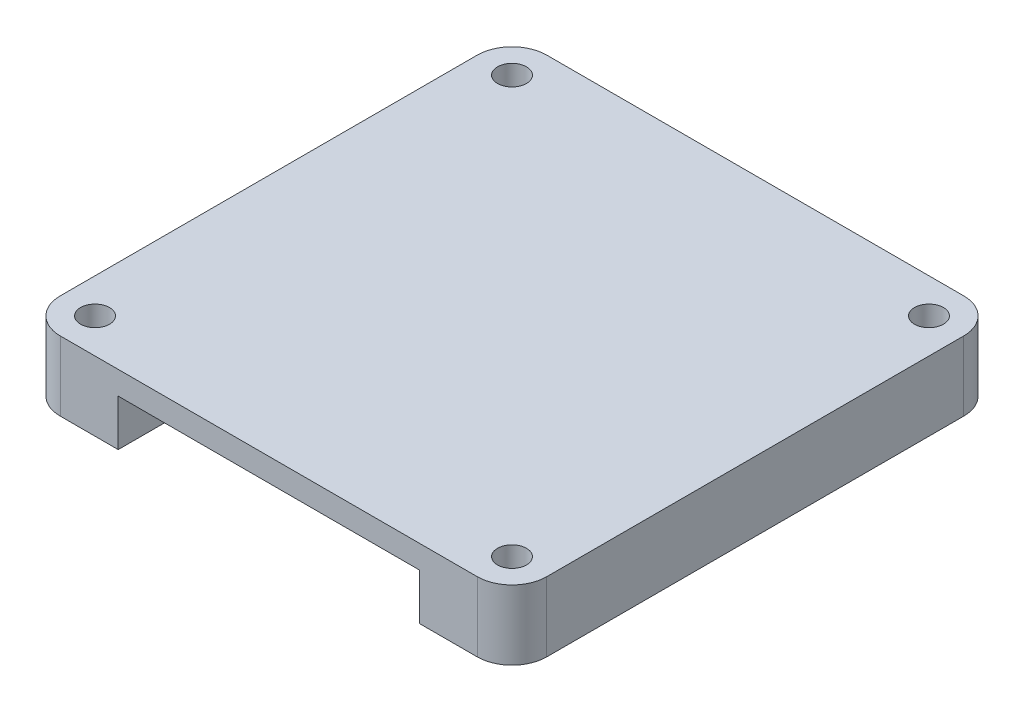
ISO-10303-21;
HEADER;
FILE_DESCRIPTION(('STEP AP214'),'2;1');
FILE_NAME('part.step','',(''),(''),'','','');
FILE_SCHEMA(('AUTOMOTIVE_DESIGN { 1 0 10303 214 1 1 1 1 }'));
ENDSEC;
DATA;
#1=APPLICATION_CONTEXT('core data for automotive mechanical design processes');
#2=APPLICATION_PROTOCOL_DEFINITION('international standard','automotive_design',2000,#1);
#3=PRODUCT_CONTEXT('',#1,'mechanical');
#4=PRODUCT('Part','Part','',(#3));
#5=PRODUCT_RELATED_PRODUCT_CATEGORY('part','',(#4));
#6=PRODUCT_DEFINITION_FORMATION('','',#4);
#7=PRODUCT_DEFINITION_CONTEXT('part definition',#1,'design');
#8=PRODUCT_DEFINITION('design','',#6,#7);
#9=PRODUCT_DEFINITION_SHAPE('','',#8);
#10=(LENGTH_UNIT() NAMED_UNIT(*) SI_UNIT(.MILLI.,.METRE.));
#11=(NAMED_UNIT(*) PLANE_ANGLE_UNIT() SI_UNIT($,.RADIAN.));
#12=(NAMED_UNIT(*) SI_UNIT($,.STERADIAN.) SOLID_ANGLE_UNIT());
#13=UNCERTAINTY_MEASURE_WITH_UNIT(LENGTH_MEASURE(1.E-05),#10,'distance_accuracy_value','');
#14=(GEOMETRIC_REPRESENTATION_CONTEXT(3) GLOBAL_UNCERTAINTY_ASSIGNED_CONTEXT((#13)) GLOBAL_UNIT_ASSIGNED_CONTEXT((#10,
#11,#12)) REPRESENTATION_CONTEXT('',''));
#15=CARTESIAN_POINT('',(0.,0.,0.));
#16=DIRECTION('',(0.,0.,1.));
#17=DIRECTION('',(1.,0.,0.));
#18=AXIS2_PLACEMENT_3D('',#15,#16,#17);
#19=CARTESIAN_POINT('',(36.,0.,0.));
#20=DIRECTION('',(0.,1.,0.));
#21=DIRECTION('',(0.,0.,1.));
#22=AXIS2_PLACEMENT_3D('',#19,#20,#21);
#23=PLANE('',#22);
#24=DIRECTION('',(0.,0.,1.));
#25=VECTOR('',#24,1.);
#26=CARTESIAN_POINT('',(5.,0.,-39.));
#27=LINE('',#26,#25);
#28=CARTESIAN_POINT('',(5.,0.,-39.));
#29=VERTEX_POINT('',#28);
#30=CARTESIAN_POINT('',(5.,0.,3.));
#31=VERTEX_POINT('',#30);
#32=EDGE_CURVE('E153',#29,#31,#27,.T.);
#33=ORIENTED_EDGE('',*,*,#32,.F.);
#34=DIRECTION('',(-1.,0.,0.));
#35=VECTOR('',#34,1.);
#36=CARTESIAN_POINT('',(0.,0.,-39.));
#37=LINE('',#36,#35);
#38=CARTESIAN_POINT('',(31.,0.,-39.));
#39=VERTEX_POINT('',#38);
#40=EDGE_CURVE('E212',#39,#29,#37,.T.);
#41=ORIENTED_EDGE('',*,*,#40,.F.);
#42=DIRECTION('',(0.,0.,-1.));
#43=VECTOR('',#42,1.);
#44=CARTESIAN_POINT('',(31.,0.,3.));
#45=LINE('',#44,#43);
#46=CARTESIAN_POINT('',(31.,0.,3.));
#47=VERTEX_POINT('',#46);
#48=EDGE_CURVE('E175',#47,#39,#45,.T.);
#49=ORIENTED_EDGE('',*,*,#48,.F.);
#50=DIRECTION('',(1.,0.,0.));
#51=VECTOR('',#50,1.);
#52=CARTESIAN_POINT('',(0.,0.,3.));
#53=LINE('',#52,#51);
#54=EDGE_CURVE('E56',#31,#47,#53,.T.);
#55=ORIENTED_EDGE('',*,*,#54,.F.);
#56=EDGE_LOOP('',(#33,#41,#49,#55));
#57=FACE_BOUND('',#56,.T.);
#58=ADVANCED_FACE('F36',(#57),#23,.F.);
#59=CARTESIAN_POINT('',(36.,2.,0.));
#60=DIRECTION('',(0.,1.,0.));
#61=DIRECTION('',(0.,0.,1.));
#62=AXIS2_PLACEMENT_3D('',#59,#60,#61);
#63=PLANE('',#62);
#64=CARTESIAN_POINT('',(0.,2.,0.));
#65=DIRECTION('',(0.,1.,0.));
#66=DIRECTION('',(0.,0.,1.));
#67=AXIS2_PLACEMENT_3D('',#64,#65,#66);
#68=CIRCLE('',#67,1.25);
#69=CARTESIAN_POINT('',(0.,2.,1.25));
#70=VERTEX_POINT('',#69);
#71=EDGE_CURVE('E203',#70,#70,#68,.T.);
#72=ORIENTED_EDGE('',*,*,#71,.F.);
#73=EDGE_LOOP('',(#72));
#74=FACE_BOUND('',#73,.T.);
#75=CARTESIAN_POINT('',(0.,2.,-36.));
#76=DIRECTION('',(0.,1.,0.));
#77=DIRECTION('',(0.,0.,1.));
#78=AXIS2_PLACEMENT_3D('',#75,#76,#77);
#79=CIRCLE('',#78,1.25);
#80=CARTESIAN_POINT('',(0.,2.,-34.75));
#81=VERTEX_POINT('',#80);
#82=EDGE_CURVE('E209',#81,#81,#79,.T.);
#83=ORIENTED_EDGE('',*,*,#82,.F.);
#84=EDGE_LOOP('',(#83));
#85=FACE_BOUND('',#84,.T.);
#86=CARTESIAN_POINT('',(36.,2.,0.));
#87=DIRECTION('',(0.,1.,0.));
#88=DIRECTION('',(0.,0.,1.));
#89=AXIS2_PLACEMENT_3D('',#86,#87,#88);
#90=CIRCLE('',#89,3.);
#91=CARTESIAN_POINT('',(36.,2.,3.));
#92=VERTEX_POINT('',#91);
#93=CARTESIAN_POINT('',(39.,2.,0.));
#94=VERTEX_POINT('',#93);
#95=EDGE_CURVE('E213',#92,#94,#90,.T.);
#96=ORIENTED_EDGE('',*,*,#95,.T.);
#97=DIRECTION('',(0.,0.,-1.));
#98=VECTOR('',#97,1.);
#99=CARTESIAN_POINT('',(39.,2.,0.));
#100=LINE('',#99,#98);
#101=CARTESIAN_POINT('',(39.,2.,-36.));
#102=VERTEX_POINT('',#101);
#103=EDGE_CURVE('E216',#94,#102,#100,.T.);
#104=ORIENTED_EDGE('',*,*,#103,.T.);
#105=CARTESIAN_POINT('',(36.,2.,-36.));
#106=DIRECTION('',(0.,1.,0.));
#107=DIRECTION('',(0.,0.,-1.));
#108=AXIS2_PLACEMENT_3D('',#105,#106,#107);
#109=CIRCLE('',#108,3.);
#110=CARTESIAN_POINT('',(36.,2.,-39.));
#111=VERTEX_POINT('',#110);
#112=EDGE_CURVE('E218',#102,#111,#109,.T.);
#113=ORIENTED_EDGE('',*,*,#112,.T.);
#114=DIRECTION('',(-1.,0.,0.));
#115=VECTOR('',#114,1.);
#116=CARTESIAN_POINT('',(0.,2.,-39.));
#117=LINE('',#116,#115);
#118=CARTESIAN_POINT('',(0.,2.,-39.));
#119=VERTEX_POINT('',#118);
#120=EDGE_CURVE('E220',#111,#119,#117,.T.);
#121=ORIENTED_EDGE('',*,*,#120,.T.);
#122=CARTESIAN_POINT('',(0.,2.,-36.));
#123=DIRECTION('',(0.,1.,0.));
#124=DIRECTION('',(0.,0.,-1.));
#125=AXIS2_PLACEMENT_3D('',#122,#123,#124);
#126=CIRCLE('',#125,3.);
#127=CARTESIAN_POINT('',(-3.,2.,-36.));
#128=VERTEX_POINT('',#127);
#129=EDGE_CURVE('E132',#119,#128,#126,.T.);
#130=ORIENTED_EDGE('',*,*,#129,.T.);
#131=DIRECTION('',(0.,0.,1.));
#132=VECTOR('',#131,1.);
#133=CARTESIAN_POINT('',(-3.,2.,0.));
#134=LINE('',#133,#132);
#135=CARTESIAN_POINT('',(-3.,2.,0.));
#136=VERTEX_POINT('',#135);
#137=EDGE_CURVE('E223',#128,#136,#134,.T.);
#138=ORIENTED_EDGE('',*,*,#137,.T.);
#139=CARTESIAN_POINT('',(0.,2.,0.));
#140=DIRECTION('',(0.,1.,0.));
#141=DIRECTION('',(0.,0.,-1.));
#142=AXIS2_PLACEMENT_3D('',#139,#140,#141);
#143=CIRCLE('',#142,3.);
#144=CARTESIAN_POINT('',(0.,2.,3.));
#145=VERTEX_POINT('',#144);
#146=EDGE_CURVE('E225',#136,#145,#143,.T.);
#147=ORIENTED_EDGE('',*,*,#146,.T.);
#148=DIRECTION('',(1.,0.,0.));
#149=VECTOR('',#148,1.);
#150=CARTESIAN_POINT('',(0.,2.,3.));
#151=LINE('',#150,#149);
#152=EDGE_CURVE('E227',#145,#92,#151,.T.);
#153=ORIENTED_EDGE('',*,*,#152,.T.);
#154=EDGE_LOOP('',(#96,#104,#113,#121,#130,#138,#147,#153));
#155=FACE_BOUND('',#154,.T.);
#156=CARTESIAN_POINT('',(36.,2.,-36.));
#157=DIRECTION('',(0.,1.,0.));
#158=DIRECTION('',(0.,0.,1.));
#159=AXIS2_PLACEMENT_3D('',#156,#157,#158);
#160=CIRCLE('',#159,1.25);
#161=CARTESIAN_POINT('',(36.,2.,-34.75));
#162=VERTEX_POINT('',#161);
#163=EDGE_CURVE('E206',#162,#162,#160,.T.);
#164=ORIENTED_EDGE('',*,*,#163,.F.);
#165=EDGE_LOOP('',(#164));
#166=FACE_BOUND('',#165,.T.);
#167=CARTESIAN_POINT('',(36.,2.,0.));
#168=DIRECTION('',(0.,1.,0.));
#169=DIRECTION('',(0.,0.,1.));
#170=AXIS2_PLACEMENT_3D('',#167,#168,#169);
#171=CIRCLE('',#170,1.25);
#172=CARTESIAN_POINT('',(36.,2.,1.25));
#173=VERTEX_POINT('',#172);
#174=EDGE_CURVE('E200',#173,#173,#171,.T.);
#175=ORIENTED_EDGE('',*,*,#174,.F.);
#176=EDGE_LOOP('',(#175));
#177=FACE_BOUND('',#176,.T.);
#178=ADVANCED_FACE('F263',(#74,#85,#155,#166,#177),#63,.T.);
#179=CARTESIAN_POINT('',(36.,2.,0.));
#180=DIRECTION('',(0.,-1.,0.));
#181=DIRECTION('',(0.,0.,-1.));
#182=AXIS2_PLACEMENT_3D('',#179,#180,#181);
#183=CYLINDRICAL_SURFACE('',#182,3.);
#184=DIRECTION('',(0.,-1.,0.));
#185=VECTOR('',#184,1.);
#186=CARTESIAN_POINT('',(36.,2.,3.));
#187=LINE('',#186,#185);
#188=CARTESIAN_POINT('',(36.,-4.,3.));
#189=VERTEX_POINT('',#188);
#190=EDGE_CURVE('E229',#92,#189,#187,.T.);
#191=ORIENTED_EDGE('',*,*,#190,.T.);
#192=CARTESIAN_POINT('',(36.,-4.,0.));
#193=DIRECTION('',(0.,-1.,0.));
#194=DIRECTION('',(0.,0.,-1.));
#195=AXIS2_PLACEMENT_3D('',#192,#193,#194);
#196=CIRCLE('',#195,3.);
#197=CARTESIAN_POINT('',(39.,-4.,0.));
#198=VERTEX_POINT('',#197);
#199=EDGE_CURVE('E176',#198,#189,#196,.T.);
#200=ORIENTED_EDGE('',*,*,#199,.F.);
#201=DIRECTION('',(0.,-1.,0.));
#202=VECTOR('',#201,1.);
#203=CARTESIAN_POINT('',(39.,2.,0.));
#204=LINE('',#203,#202);
#205=EDGE_CURVE('E11',#94,#198,#204,.T.);
#206=ORIENTED_EDGE('',*,*,#205,.F.);
#207=ORIENTED_EDGE('',*,*,#95,.F.);
#208=EDGE_LOOP('',(#191,#200,#206,#207));
#209=FACE_BOUND('',#208,.T.);
#210=ADVANCED_FACE('F38',(#209),#183,.T.);
#211=CARTESIAN_POINT('',(39.,2.,0.));
#212=DIRECTION('',(-1.,0.,0.));
#213=DIRECTION('',(0.,0.,1.));
#214=AXIS2_PLACEMENT_3D('',#211,#212,#213);
#215=PLANE('',#214);
#216=ORIENTED_EDGE('',*,*,#205,.T.);
#217=DIRECTION('',(0.,0.,1.));
#218=VECTOR('',#217,1.);
#219=CARTESIAN_POINT('',(39.,-4.,0.));
#220=LINE('',#219,#218);
#221=CARTESIAN_POINT('',(39.,-4.,-36.));
#222=VERTEX_POINT('',#221);
#223=EDGE_CURVE('E189',#222,#198,#220,.T.);
#224=ORIENTED_EDGE('',*,*,#223,.F.);
#225=DIRECTION('',(0.,-1.,0.));
#226=VECTOR('',#225,1.);
#227=CARTESIAN_POINT('',(39.,2.,-36.));
#228=LINE('',#227,#226);
#229=EDGE_CURVE('E44',#102,#222,#228,.T.);
#230=ORIENTED_EDGE('',*,*,#229,.F.);
#231=ORIENTED_EDGE('',*,*,#103,.F.);
#232=EDGE_LOOP('',(#216,#224,#230,#231));
#233=FACE_BOUND('',#232,.T.);
#234=ADVANCED_FACE('F251',(#233),#215,.F.);
#235=CARTESIAN_POINT('',(36.,2.,-36.));
#236=DIRECTION('',(0.,-1.,0.));
#237=DIRECTION('',(0.,0.,-1.));
#238=AXIS2_PLACEMENT_3D('',#235,#236,#237);
#239=CYLINDRICAL_SURFACE('',#238,3.);
#240=ORIENTED_EDGE('',*,*,#229,.T.);
#241=CARTESIAN_POINT('',(36.,-4.,-36.));
#242=DIRECTION('',(0.,-1.,0.));
#243=DIRECTION('',(0.,0.,-1.));
#244=AXIS2_PLACEMENT_3D('',#241,#242,#243);
#245=CIRCLE('',#244,3.);
#246=CARTESIAN_POINT('',(36.,-4.,-39.));
#247=VERTEX_POINT('',#246);
#248=EDGE_CURVE('E186',#247,#222,#245,.T.);
#249=ORIENTED_EDGE('',*,*,#248,.F.);
#250=DIRECTION('',(0.,-1.,0.));
#251=VECTOR('',#250,1.);
#252=CARTESIAN_POINT('',(36.,2.,-39.));
#253=LINE('',#252,#251);
#254=EDGE_CURVE('E135',#111,#247,#253,.T.);
#255=ORIENTED_EDGE('',*,*,#254,.F.);
#256=ORIENTED_EDGE('',*,*,#112,.F.);
#257=EDGE_LOOP('',(#240,#249,#255,#256));
#258=FACE_BOUND('',#257,.T.);
#259=ADVANCED_FACE('F242',(#258),#239,.T.);
#260=CARTESIAN_POINT('',(0.,2.,-39.));
#261=DIRECTION('',(0.,0.,1.));
#262=DIRECTION('',(1.,0.,0.));
#263=AXIS2_PLACEMENT_3D('',#260,#261,#262);
#264=PLANE('',#263);
#265=ORIENTED_EDGE('',*,*,#254,.T.);
#266=DIRECTION('',(1.,0.,0.));
#267=VECTOR('',#266,1.);
#268=CARTESIAN_POINT('',(31.,-4.,-39.));
#269=LINE('',#268,#267);
#270=CARTESIAN_POINT('',(31.,-4.,-39.));
#271=VERTEX_POINT('',#270);
#272=EDGE_CURVE('E183',#271,#247,#269,.T.);
#273=ORIENTED_EDGE('',*,*,#272,.F.);
#274=DIRECTION('',(0.,1.,0.));
#275=VECTOR('',#274,1.);
#276=CARTESIAN_POINT('',(31.,-4.,-39.));
#277=LINE('',#276,#275);
#278=EDGE_CURVE('E192',#271,#39,#277,.T.);
#279=ORIENTED_EDGE('',*,*,#278,.T.);
#280=ORIENTED_EDGE('',*,*,#40,.T.);
#281=DIRECTION('',(0.,1.,0.));
#282=VECTOR('',#281,1.);
#283=CARTESIAN_POINT('',(5.,-4.,-39.));
#284=LINE('',#283,#282);
#285=CARTESIAN_POINT('',(5.,-4.,-39.));
#286=VERTEX_POINT('',#285);
#287=EDGE_CURVE('E142',#286,#29,#284,.T.);
#288=ORIENTED_EDGE('',*,*,#287,.F.);
#289=DIRECTION('',(1.,0.,0.));
#290=VECTOR('',#289,1.);
#291=CARTESIAN_POINT('',(5.,-4.,-39.));
#292=LINE('',#291,#290);
#293=CARTESIAN_POINT('',(0.,-4.,-39.));
#294=VERTEX_POINT('',#293);
#295=EDGE_CURVE('E139',#294,#286,#292,.T.);
#296=ORIENTED_EDGE('',*,*,#295,.F.);
#297=DIRECTION('',(0.,-1.,0.));
#298=VECTOR('',#297,1.);
#299=CARTESIAN_POINT('',(0.,2.,-39.));
#300=LINE('',#299,#298);
#301=EDGE_CURVE('E126',#119,#294,#300,.T.);
#302=ORIENTED_EDGE('',*,*,#301,.F.);
#303=ORIENTED_EDGE('',*,*,#120,.F.);
#304=EDGE_LOOP('',(#265,#273,#279,#280,#288,#296,#302,#303));
#305=FACE_BOUND('',#304,.T.);
#306=ADVANCED_FACE('F140',(#305),#264,.F.);
#307=CARTESIAN_POINT('',(0.,2.,-36.));
#308=DIRECTION('',(0.,-1.,0.));
#309=DIRECTION('',(0.,0.,-1.));
#310=AXIS2_PLACEMENT_3D('',#307,#308,#309);
#311=CYLINDRICAL_SURFACE('',#310,3.);
#312=ORIENTED_EDGE('',*,*,#301,.T.);
#313=CARTESIAN_POINT('',(0.,-4.,-36.));
#314=DIRECTION('',(0.,-1.,0.));
#315=DIRECTION('',(0.,0.,-1.));
#316=AXIS2_PLACEMENT_3D('',#313,#314,#315);
#317=CIRCLE('',#316,3.);
#318=CARTESIAN_POINT('',(-3.,-4.,-36.));
#319=VERTEX_POINT('',#318);
#320=EDGE_CURVE('E131',#319,#294,#317,.T.);
#321=ORIENTED_EDGE('',*,*,#320,.F.);
#322=DIRECTION('',(0.,-1.,0.));
#323=VECTOR('',#322,1.);
#324=CARTESIAN_POINT('',(-3.,2.,-36.));
#325=LINE('',#324,#323);
#326=EDGE_CURVE('E136',#128,#319,#325,.T.);
#327=ORIENTED_EDGE('',*,*,#326,.F.);
#328=ORIENTED_EDGE('',*,*,#129,.F.);
#329=EDGE_LOOP('',(#312,#321,#327,#328));
#330=FACE_BOUND('',#329,.T.);
#331=ADVANCED_FACE('F128',(#330),#311,.T.);
#332=CARTESIAN_POINT('',(-3.,2.,0.));
#333=DIRECTION('',(1.,0.,0.));
#334=DIRECTION('',(0.,0.,-1.));
#335=AXIS2_PLACEMENT_3D('',#332,#333,#334);
#336=PLANE('',#335);
#337=ORIENTED_EDGE('',*,*,#326,.T.);
#338=DIRECTION('',(0.,0.,-1.));
#339=VECTOR('',#338,1.);
#340=CARTESIAN_POINT('',(-3.,-4.,-36.));
#341=LINE('',#340,#339);
#342=CARTESIAN_POINT('',(-3.,-4.,0.));
#343=VERTEX_POINT('',#342);
#344=EDGE_CURVE('E152',#343,#319,#341,.T.);
#345=ORIENTED_EDGE('',*,*,#344,.F.);
#346=DIRECTION('',(0.,-1.,0.));
#347=VECTOR('',#346,1.);
#348=CARTESIAN_POINT('',(-3.,2.,0.));
#349=LINE('',#348,#347);
#350=EDGE_CURVE('E235',#136,#343,#349,.T.);
#351=ORIENTED_EDGE('',*,*,#350,.F.);
#352=ORIENTED_EDGE('',*,*,#137,.F.);
#353=EDGE_LOOP('',(#337,#345,#351,#352));
#354=FACE_BOUND('',#353,.T.);
#355=ADVANCED_FACE('F274',(#354),#336,.F.);
#356=CARTESIAN_POINT('',(0.,2.,0.));
#357=DIRECTION('',(0.,-1.,0.));
#358=DIRECTION('',(0.,0.,-1.));
#359=AXIS2_PLACEMENT_3D('',#356,#357,#358);
#360=CYLINDRICAL_SURFACE('',#359,3.);
#361=ORIENTED_EDGE('',*,*,#350,.T.);
#362=CARTESIAN_POINT('',(0.,-4.,0.));
#363=DIRECTION('',(0.,-1.,0.));
#364=DIRECTION('',(0.,0.,-1.));
#365=AXIS2_PLACEMENT_3D('',#362,#363,#364);
#366=CIRCLE('',#365,3.);
#367=CARTESIAN_POINT('',(0.,-4.,3.));
#368=VERTEX_POINT('',#367);
#369=EDGE_CURVE('E164',#368,#343,#366,.T.);
#370=ORIENTED_EDGE('',*,*,#369,.F.);
#371=DIRECTION('',(0.,-1.,0.));
#372=VECTOR('',#371,1.);
#373=CARTESIAN_POINT('',(0.,2.,3.));
#374=LINE('',#373,#372);
#375=EDGE_CURVE('E233',#145,#368,#374,.T.);
#376=ORIENTED_EDGE('',*,*,#375,.F.);
#377=ORIENTED_EDGE('',*,*,#146,.F.);
#378=EDGE_LOOP('',(#361,#370,#376,#377));
#379=FACE_BOUND('',#378,.T.);
#380=ADVANCED_FACE('F270',(#379),#360,.T.);
#381=CARTESIAN_POINT('',(0.,2.,3.));
#382=DIRECTION('',(0.,0.,-1.));
#383=DIRECTION('',(-1.,0.,0.));
#384=AXIS2_PLACEMENT_3D('',#381,#382,#383);
#385=PLANE('',#384);
#386=ORIENTED_EDGE('',*,*,#375,.T.);
#387=DIRECTION('',(-1.,0.,0.));
#388=VECTOR('',#387,1.);
#389=CARTESIAN_POINT('',(5.,-4.,3.));
#390=LINE('',#389,#388);
#391=CARTESIAN_POINT('',(5.,-4.,3.));
#392=VERTEX_POINT('',#391);
#393=EDGE_CURVE('E161',#392,#368,#390,.T.);
#394=ORIENTED_EDGE('',*,*,#393,.F.);
#395=DIRECTION('',(0.,1.,0.));
#396=VECTOR('',#395,1.);
#397=CARTESIAN_POINT('',(5.,-4.,3.));
#398=LINE('',#397,#396);
#399=EDGE_CURVE('E51',#392,#31,#398,.T.);
#400=ORIENTED_EDGE('',*,*,#399,.T.);
#401=ORIENTED_EDGE('',*,*,#54,.T.);
#402=DIRECTION('',(0.,1.,0.));
#403=VECTOR('',#402,1.);
#404=CARTESIAN_POINT('',(31.,-4.,3.));
#405=LINE('',#404,#403);
#406=CARTESIAN_POINT('',(31.,-4.,3.));
#407=VERTEX_POINT('',#406);
#408=EDGE_CURVE('E197',#407,#47,#405,.T.);
#409=ORIENTED_EDGE('',*,*,#408,.F.);
#410=DIRECTION('',(-1.,0.,0.));
#411=VECTOR('',#410,1.);
#412=CARTESIAN_POINT('',(36.,-4.,3.));
#413=LINE('',#412,#411);
#414=EDGE_CURVE('E179',#189,#407,#413,.T.);
#415=ORIENTED_EDGE('',*,*,#414,.F.);
#416=ORIENTED_EDGE('',*,*,#190,.F.);
#417=ORIENTED_EDGE('',*,*,#152,.F.);
#418=EDGE_LOOP('',(#386,#394,#400,#401,#409,#415,#416,#417));
#419=FACE_BOUND('',#418,.T.);
#420=ADVANCED_FACE('F259',(#419),#385,.F.);
#421=CARTESIAN_POINT('',(0.,2.,-36.));
#422=DIRECTION('',(0.,-1.,0.));
#423=DIRECTION('',(0.,0.,-1.));
#424=AXIS2_PLACEMENT_3D('',#421,#422,#423);
#425=CYLINDRICAL_SURFACE('',#424,1.25);
#426=ORIENTED_EDGE('',*,*,#82,.T.);
#427=EDGE_LOOP('',(#426));
#428=FACE_BOUND('',#427,.T.);
#429=CARTESIAN_POINT('',(0.,-4.,-36.));
#430=DIRECTION('',(0.,-1.,0.));
#431=DIRECTION('',(0.,0.,-1.));
#432=AXIS2_PLACEMENT_3D('',#429,#430,#431);
#433=CIRCLE('',#432,1.25);
#434=CARTESIAN_POINT('',(0.,-4.,-37.25));
#435=VERTEX_POINT('',#434);
#436=EDGE_CURVE('E155',#435,#435,#433,.T.);
#437=ORIENTED_EDGE('',*,*,#436,.T.);
#438=EDGE_LOOP('',(#437));
#439=FACE_BOUND('',#438,.T.);
#440=ADVANCED_FACE('F295',(#428,#439),#425,.F.);
#441=CARTESIAN_POINT('',(36.,2.,-36.));
#442=DIRECTION('',(0.,-1.,0.));
#443=DIRECTION('',(0.,0.,-1.));
#444=AXIS2_PLACEMENT_3D('',#441,#442,#443);
#445=CYLINDRICAL_SURFACE('',#444,1.25);
#446=ORIENTED_EDGE('',*,*,#163,.T.);
#447=EDGE_LOOP('',(#446));
#448=FACE_BOUND('',#447,.T.);
#449=CARTESIAN_POINT('',(36.,-4.,-36.));
#450=DIRECTION('',(0.,-1.,0.));
#451=DIRECTION('',(0.,0.,-1.));
#452=AXIS2_PLACEMENT_3D('',#449,#450,#451);
#453=CIRCLE('',#452,1.25);
#454=CARTESIAN_POINT('',(36.,-4.,-37.25));
#455=VERTEX_POINT('',#454);
#456=EDGE_CURVE('E172',#455,#455,#453,.T.);
#457=ORIENTED_EDGE('',*,*,#456,.T.);
#458=EDGE_LOOP('',(#457));
#459=FACE_BOUND('',#458,.T.);
#460=ADVANCED_FACE('F299',(#448,#459),#445,.F.);
#461=CARTESIAN_POINT('',(0.,2.,0.));
#462=DIRECTION('',(0.,-1.,0.));
#463=DIRECTION('',(0.,0.,-1.));
#464=AXIS2_PLACEMENT_3D('',#461,#462,#463);
#465=CYLINDRICAL_SURFACE('',#464,1.25);
#466=ORIENTED_EDGE('',*,*,#71,.T.);
#467=EDGE_LOOP('',(#466));
#468=FACE_BOUND('',#467,.T.);
#469=CARTESIAN_POINT('',(0.,-4.,0.));
#470=DIRECTION('',(0.,-1.,0.));
#471=DIRECTION('',(0.,0.,-1.));
#472=AXIS2_PLACEMENT_3D('',#469,#470,#471);
#473=CIRCLE('',#472,1.25);
#474=CARTESIAN_POINT('',(0.,-4.,-1.25));
#475=VERTEX_POINT('',#474);
#476=EDGE_CURVE('E331',#475,#475,#473,.T.);
#477=ORIENTED_EDGE('',*,*,#476,.T.);
#478=EDGE_LOOP('',(#477));
#479=FACE_BOUND('',#478,.T.);
#480=ADVANCED_FACE('F304',(#468,#479),#465,.F.);
#481=CARTESIAN_POINT('',(36.,2.,0.));
#482=DIRECTION('',(0.,-1.,0.));
#483=DIRECTION('',(0.,0.,-1.));
#484=AXIS2_PLACEMENT_3D('',#481,#482,#483);
#485=CYLINDRICAL_SURFACE('',#484,1.25);
#486=ORIENTED_EDGE('',*,*,#174,.T.);
#487=EDGE_LOOP('',(#486));
#488=FACE_BOUND('',#487,.T.);
#489=CARTESIAN_POINT('',(36.,-4.,0.));
#490=DIRECTION('',(0.,-1.,0.));
#491=DIRECTION('',(0.,0.,-1.));
#492=AXIS2_PLACEMENT_3D('',#489,#490,#491);
#493=CIRCLE('',#492,1.25);
#494=CARTESIAN_POINT('',(36.,-4.,-1.25));
#495=VERTEX_POINT('',#494);
#496=EDGE_CURVE('E169',#495,#495,#493,.T.);
#497=ORIENTED_EDGE('',*,*,#496,.T.);
#498=EDGE_LOOP('',(#497));
#499=FACE_BOUND('',#498,.T.);
#500=ADVANCED_FACE('F311',(#488,#499),#485,.F.);
#501=CARTESIAN_POINT('',(36.,-4.,0.));
#502=DIRECTION('',(0.,-1.,0.));
#503=DIRECTION('',(0.,0.,-1.));
#504=AXIS2_PLACEMENT_3D('',#501,#502,#503);
#505=PLANE('',#504);
#506=ORIENTED_EDGE('',*,*,#456,.F.);
#507=EDGE_LOOP('',(#506));
#508=FACE_BOUND('',#507,.T.);
#509=ORIENTED_EDGE('',*,*,#199,.T.);
#510=ORIENTED_EDGE('',*,*,#414,.T.);
#511=DIRECTION('',(0.,0.,-1.));
#512=VECTOR('',#511,1.);
#513=CARTESIAN_POINT('',(31.,-4.,3.));
#514=LINE('',#513,#512);
#515=EDGE_CURVE('E181',#407,#271,#514,.T.);
#516=ORIENTED_EDGE('',*,*,#515,.T.);
#517=ORIENTED_EDGE('',*,*,#272,.T.);
#518=ORIENTED_EDGE('',*,*,#248,.T.);
#519=ORIENTED_EDGE('',*,*,#223,.T.);
#520=EDGE_LOOP('',(#509,#510,#516,#517,#518,#519));
#521=FACE_BOUND('',#520,.T.);
#522=ORIENTED_EDGE('',*,*,#496,.F.);
#523=EDGE_LOOP('',(#522));
#524=FACE_BOUND('',#523,.T.);
#525=ADVANCED_FACE('F247',(#508,#521,#524),#505,.T.);
#526=CARTESIAN_POINT('',(31.,-4.,3.));
#527=DIRECTION('',(1.,0.,0.));
#528=DIRECTION('',(0.,0.,-1.));
#529=AXIS2_PLACEMENT_3D('',#526,#527,#528);
#530=PLANE('',#529);
#531=ORIENTED_EDGE('',*,*,#48,.T.);
#532=ORIENTED_EDGE('',*,*,#278,.F.);
#533=ORIENTED_EDGE('',*,*,#515,.F.);
#534=ORIENTED_EDGE('',*,*,#408,.T.);
#535=EDGE_LOOP('',(#531,#532,#533,#534));
#536=FACE_BOUND('',#535,.T.);
#537=ADVANCED_FACE('F261',(#536),#530,.F.);
#538=CARTESIAN_POINT('',(0.,-4.,-36.));
#539=DIRECTION('',(0.,-1.,0.));
#540=DIRECTION('',(0.,0.,-1.));
#541=AXIS2_PLACEMENT_3D('',#538,#539,#540);
#542=PLANE('',#541);
#543=ORIENTED_EDGE('',*,*,#436,.F.);
#544=EDGE_LOOP('',(#543));
#545=FACE_BOUND('',#544,.T.);
#546=ORIENTED_EDGE('',*,*,#320,.T.);
#547=ORIENTED_EDGE('',*,*,#295,.T.);
#548=DIRECTION('',(0.,0.,1.));
#549=VECTOR('',#548,1.);
#550=CARTESIAN_POINT('',(5.,-4.,-39.));
#551=LINE('',#550,#549);
#552=EDGE_CURVE('E145',#286,#392,#551,.T.);
#553=ORIENTED_EDGE('',*,*,#552,.T.);
#554=ORIENTED_EDGE('',*,*,#393,.T.);
#555=ORIENTED_EDGE('',*,*,#369,.T.);
#556=ORIENTED_EDGE('',*,*,#344,.T.);
#557=EDGE_LOOP('',(#546,#547,#553,#554,#555,#556));
#558=FACE_BOUND('',#557,.T.);
#559=ORIENTED_EDGE('',*,*,#476,.F.);
#560=EDGE_LOOP('',(#559));
#561=FACE_BOUND('',#560,.T.);
#562=ADVANCED_FACE('F148',(#545,#558,#561),#542,.T.);
#563=CARTESIAN_POINT('',(5.,-4.,-39.));
#564=DIRECTION('',(-1.,0.,0.));
#565=DIRECTION('',(0.,0.,1.));
#566=AXIS2_PLACEMENT_3D('',#563,#564,#565);
#567=PLANE('',#566);
#568=ORIENTED_EDGE('',*,*,#32,.T.);
#569=ORIENTED_EDGE('',*,*,#399,.F.);
#570=ORIENTED_EDGE('',*,*,#552,.F.);
#571=ORIENTED_EDGE('',*,*,#287,.T.);
#572=EDGE_LOOP('',(#568,#569,#570,#571));
#573=FACE_BOUND('',#572,.T.);
#574=ADVANCED_FACE('F321',(#573),#567,.F.);
#575=CLOSED_SHELL('',(#58,#178,#210,#234,#259,#306,#331,#355,#380,#420,#440,#460,#480,#500,#525,
#537,#562,#574));
#576=MANIFOLD_SOLID_BREP('B2',#575);
#577=ADVANCED_BREP_SHAPE_REPRESENTATION('',(#18,#576),#14);
#578=SHAPE_DEFINITION_REPRESENTATION(#9,#577);
ENDSEC;
END-ISO-10303-21;
